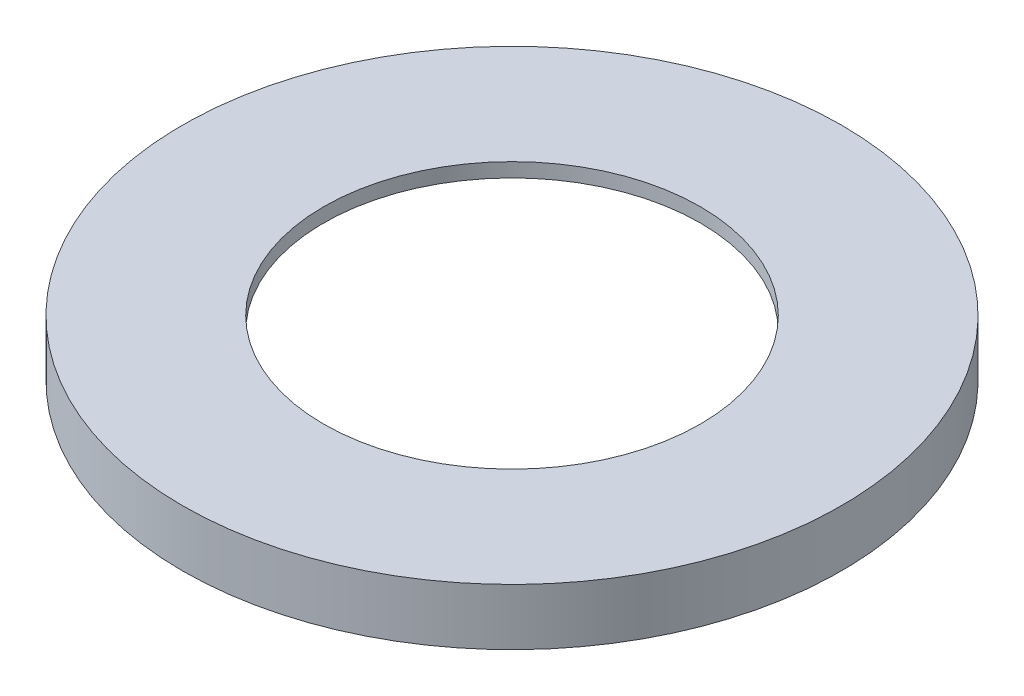
ISO-10303-21;
HEADER;
FILE_DESCRIPTION(('STEP AP214'),'2;1');
FILE_NAME('part.step','',(''),(''),'','','');
FILE_SCHEMA(('AUTOMOTIVE_DESIGN { 1 0 10303 214 1 1 1 1 }'));
ENDSEC;
DATA;
#1=APPLICATION_CONTEXT('core data for automotive mechanical design processes');
#2=APPLICATION_PROTOCOL_DEFINITION('international standard','automotive_design',2000,#1);
#3=PRODUCT_CONTEXT('',#1,'mechanical');
#4=PRODUCT('Part','Part','',(#3));
#5=PRODUCT_RELATED_PRODUCT_CATEGORY('part','',(#4));
#6=PRODUCT_DEFINITION_FORMATION('','',#4);
#7=PRODUCT_DEFINITION_CONTEXT('part definition',#1,'design');
#8=PRODUCT_DEFINITION('design','',#6,#7);
#9=PRODUCT_DEFINITION_SHAPE('','',#8);
#10=(LENGTH_UNIT() NAMED_UNIT(*) SI_UNIT(.MILLI.,.METRE.));
#11=(NAMED_UNIT(*) PLANE_ANGLE_UNIT() SI_UNIT($,.RADIAN.));
#12=(NAMED_UNIT(*) SI_UNIT($,.STERADIAN.) SOLID_ANGLE_UNIT());
#13=UNCERTAINTY_MEASURE_WITH_UNIT(LENGTH_MEASURE(1.E-05),#10,'distance_accuracy_value','');
#14=(GEOMETRIC_REPRESENTATION_CONTEXT(3) GLOBAL_UNCERTAINTY_ASSIGNED_CONTEXT((#13)) GLOBAL_UNIT_ASSIGNED_CONTEXT((#10,
#11,#12)) REPRESENTATION_CONTEXT('',''));
#15=CARTESIAN_POINT('',(0.,0.,0.));
#16=DIRECTION('',(0.,0.,1.));
#17=DIRECTION('',(1.,0.,0.));
#18=AXIS2_PLACEMENT_3D('',#15,#16,#17);
#19=CARTESIAN_POINT('',(0.,6.,0.));
#20=DIRECTION('',(0.,-1.,0.));
#21=DIRECTION('',(0.,0.,-1.));
#22=AXIS2_PLACEMENT_3D('',#19,#20,#21);
#23=CYLINDRICAL_SURFACE('',#22,20.);
#24=CARTESIAN_POINT('',(0.,6.,0.));
#25=DIRECTION('',(0.,1.,0.));
#26=DIRECTION('',(0.,0.,1.));
#27=AXIS2_PLACEMENT_3D('',#24,#25,#26);
#28=CIRCLE('',#27,20.);
#29=CARTESIAN_POINT('',(0.,6.,20.));
#30=VERTEX_POINT('',#29);
#31=EDGE_CURVE('E52',#30,#30,#28,.T.);
#32=ORIENTED_EDGE('',*,*,#31,.T.);
#33=EDGE_LOOP('',(#32));
#34=FACE_BOUND('',#33,.T.);
#35=CARTESIAN_POINT('',(0.,4.5,0.));
#36=DIRECTION('',(0.,-1.,0.));
#37=DIRECTION('',(0.,0.,-1.));
#38=AXIS2_PLACEMENT_3D('',#35,#36,#37);
#39=CIRCLE('',#38,20.);
#40=CARTESIAN_POINT('',(0.,4.5,-20.));
#41=VERTEX_POINT('',#40);
#42=EDGE_CURVE('E56',#41,#41,#39,.T.);
#43=ORIENTED_EDGE('',*,*,#42,.T.);
#44=EDGE_LOOP('',(#43));
#45=FACE_BOUND('',#44,.T.);
#46=ADVANCED_FACE('F41',(#34,#45),#23,.F.);
#47=CARTESIAN_POINT('',(0.,6.,0.));
#48=DIRECTION('',(0.,1.,0.));
#49=DIRECTION('',(0.,0.,1.));
#50=AXIS2_PLACEMENT_3D('',#47,#48,#49);
#51=PLANE('',#50);
#52=CARTESIAN_POINT('',(0.,6.,0.));
#53=DIRECTION('',(0.,1.,0.));
#54=DIRECTION('',(0.,0.,1.));
#55=AXIS2_PLACEMENT_3D('',#52,#53,#54);
#56=CIRCLE('',#55,35.);
#57=CARTESIAN_POINT('',(0.,6.,35.));
#58=VERTEX_POINT('',#57);
#59=EDGE_CURVE('E10',#58,#58,#56,.T.);
#60=ORIENTED_EDGE('',*,*,#59,.T.);
#61=EDGE_LOOP('',(#60));
#62=FACE_BOUND('',#61,.T.);
#63=ORIENTED_EDGE('',*,*,#31,.F.);
#64=EDGE_LOOP('',(#63));
#65=FACE_BOUND('',#64,.T.);
#66=ADVANCED_FACE('F72',(#62,#65),#51,.T.);
#67=CARTESIAN_POINT('',(0.,0.,0.));
#68=DIRECTION('',(0.,1.,0.));
#69=DIRECTION('',(0.,0.,1.));
#70=AXIS2_PLACEMENT_3D('',#67,#68,#69);
#71=PLANE('',#70);
#72=CARTESIAN_POINT('',(0.,0.,0.));
#73=DIRECTION('',(0.,-1.,0.));
#74=DIRECTION('',(0.,0.,-1.));
#75=AXIS2_PLACEMENT_3D('',#72,#73,#74);
#76=CIRCLE('',#75,31.);
#77=CARTESIAN_POINT('',(0.,0.,-31.));
#78=VERTEX_POINT('',#77);
#79=EDGE_CURVE('E62',#78,#78,#76,.T.);
#80=ORIENTED_EDGE('',*,*,#79,.F.);
#81=EDGE_LOOP('',(#80));
#82=FACE_BOUND('',#81,.T.);
#83=CARTESIAN_POINT('',(0.,0.,0.));
#84=DIRECTION('',(0.,1.,0.));
#85=DIRECTION('',(0.,0.,1.));
#86=AXIS2_PLACEMENT_3D('',#83,#84,#85);
#87=CIRCLE('',#86,35.);
#88=CARTESIAN_POINT('',(0.,0.,35.));
#89=VERTEX_POINT('',#88);
#90=EDGE_CURVE('E45',#89,#89,#87,.T.);
#91=ORIENTED_EDGE('',*,*,#90,.F.);
#92=EDGE_LOOP('',(#91));
#93=FACE_BOUND('',#92,.T.);
#94=ADVANCED_FACE('F69',(#82,#93),#71,.F.);
#95=CARTESIAN_POINT('',(0.,6.,0.));
#96=DIRECTION('',(0.,-1.,0.));
#97=DIRECTION('',(0.,0.,-1.));
#98=AXIS2_PLACEMENT_3D('',#95,#96,#97);
#99=CYLINDRICAL_SURFACE('',#98,35.);
#100=ORIENTED_EDGE('',*,*,#59,.F.);
#101=EDGE_LOOP('',(#100));
#102=FACE_BOUND('',#101,.T.);
#103=ORIENTED_EDGE('',*,*,#90,.T.);
#104=EDGE_LOOP('',(#103));
#105=FACE_BOUND('',#104,.T.);
#106=ADVANCED_FACE('F43',(#102,#105),#99,.T.);
#107=CARTESIAN_POINT('',(0.,4.5,20.));
#108=DIRECTION('',(0.,-1.,0.));
#109=DIRECTION('',(0.,0.,-1.));
#110=AXIS2_PLACEMENT_3D('',#107,#108,#109);
#111=PLANE('',#110);
#112=CARTESIAN_POINT('',(0.,4.5,0.));
#113=DIRECTION('',(0.,-1.,0.));
#114=DIRECTION('',(0.,0.,-1.));
#115=AXIS2_PLACEMENT_3D('',#112,#113,#114);
#116=CIRCLE('',#115,31.);
#117=CARTESIAN_POINT('',(0.,4.5,-31.));
#118=VERTEX_POINT('',#117);
#119=EDGE_CURVE('E59',#118,#118,#116,.T.);
#120=ORIENTED_EDGE('',*,*,#119,.T.);
#121=EDGE_LOOP('',(#120));
#122=FACE_BOUND('',#121,.T.);
#123=ORIENTED_EDGE('',*,*,#42,.F.);
#124=EDGE_LOOP('',(#123));
#125=FACE_BOUND('',#124,.T.);
#126=ADVANCED_FACE('F76',(#122,#125),#111,.T.);
#127=CARTESIAN_POINT('',(0.,0.,0.));
#128=DIRECTION('',(0.,-1.,0.));
#129=DIRECTION('',(0.,0.,-1.));
#130=AXIS2_PLACEMENT_3D('',#127,#128,#129);
#131=CYLINDRICAL_SURFACE('',#130,31.);
#132=ORIENTED_EDGE('',*,*,#79,.T.);
#133=EDGE_LOOP('',(#132));
#134=FACE_BOUND('',#133,.T.);
#135=ORIENTED_EDGE('',*,*,#119,.F.);
#136=EDGE_LOOP('',(#135));
#137=FACE_BOUND('',#136,.T.);
#138=ADVANCED_FACE('F66',(#134,#137),#131,.F.);
#139=CLOSED_SHELL('',(#46,#66,#94,#106,#126,#138));
#140=MANIFOLD_SOLID_BREP('B2',#139);
#141=ADVANCED_BREP_SHAPE_REPRESENTATION('',(#18,#140),#14);
#142=SHAPE_DEFINITION_REPRESENTATION(#9,#141);
ENDSEC;
END-ISO-10303-21;
